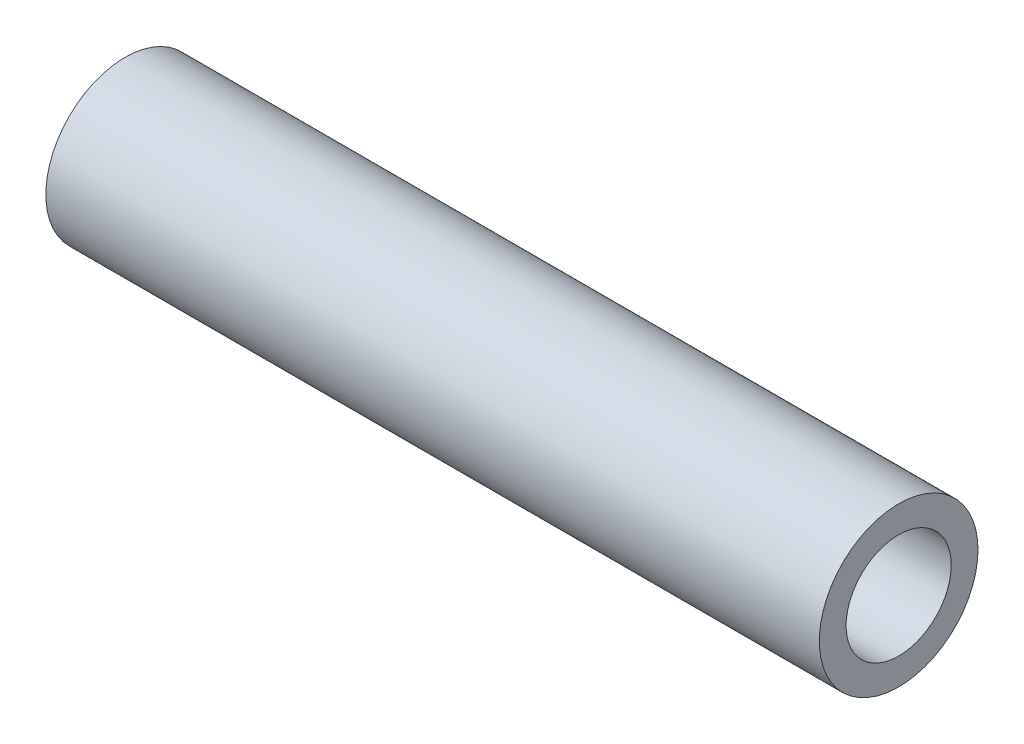
ISO-10303-21;
HEADER;
FILE_DESCRIPTION(('STEP AP214'),'2;1');
FILE_NAME('part.step','',(''),(''),'','','');
FILE_SCHEMA(('AUTOMOTIVE_DESIGN { 1 0 10303 214 1 1 1 1 }'));
ENDSEC;
DATA;
#1=APPLICATION_CONTEXT('core data for automotive mechanical design processes');
#2=APPLICATION_PROTOCOL_DEFINITION('international standard','automotive_design',2000,#1);
#3=PRODUCT_CONTEXT('',#1,'mechanical');
#4=PRODUCT('Part','Part','',(#3));
#5=PRODUCT_RELATED_PRODUCT_CATEGORY('part','',(#4));
#6=PRODUCT_DEFINITION_FORMATION('','',#4);
#7=PRODUCT_DEFINITION_CONTEXT('part definition',#1,'design');
#8=PRODUCT_DEFINITION('design','',#6,#7);
#9=PRODUCT_DEFINITION_SHAPE('','',#8);
#10=(LENGTH_UNIT() NAMED_UNIT(*) SI_UNIT(.MILLI.,.METRE.));
#11=(NAMED_UNIT(*) PLANE_ANGLE_UNIT() SI_UNIT($,.RADIAN.));
#12=(NAMED_UNIT(*) SI_UNIT($,.STERADIAN.) SOLID_ANGLE_UNIT());
#13=UNCERTAINTY_MEASURE_WITH_UNIT(LENGTH_MEASURE(1.E-05),#10,'distance_accuracy_value','');
#14=(GEOMETRIC_REPRESENTATION_CONTEXT(3) GLOBAL_UNCERTAINTY_ASSIGNED_CONTEXT((#13)) GLOBAL_UNIT_ASSIGNED_CONTEXT((#10,
#11,#12)) REPRESENTATION_CONTEXT('',''));
#15=CARTESIAN_POINT('',(0.,0.,0.));
#16=DIRECTION('',(0.,0.,1.));
#17=DIRECTION('',(1.,0.,0.));
#18=AXIS2_PLACEMENT_3D('',#15,#16,#17);
#19=CARTESIAN_POINT('',(39.,0.,0.));
#20=DIRECTION('',(1.,0.,0.));
#21=DIRECTION('',(0.,0.,-1.));
#22=AXIS2_PLACEMENT_3D('',#19,#20,#21);
#23=PLANE('',#22);
#24=CARTESIAN_POINT('',(39.,0.,0.));
#25=DIRECTION('',(1.,0.,0.));
#26=DIRECTION('',(0.,0.,-1.));
#27=AXIS2_PLACEMENT_3D('',#24,#25,#26);
#28=CIRCLE('',#27,4.);
#29=CARTESIAN_POINT('',(39.,0.,-4.));
#30=VERTEX_POINT('',#29);
#31=EDGE_CURVE('E10',#30,#30,#28,.T.);
#32=ORIENTED_EDGE('',*,*,#31,.T.);
#33=EDGE_LOOP('',(#32));
#34=FACE_BOUND('',#33,.T.);
#35=CARTESIAN_POINT('',(39.,0.,0.));
#36=DIRECTION('',(1.,0.,0.));
#37=DIRECTION('',(0.,0.,-1.));
#38=AXIS2_PLACEMENT_3D('',#35,#36,#37);
#39=CIRCLE('',#38,2.65);
#40=CARTESIAN_POINT('',(39.,0.,-2.65));
#41=VERTEX_POINT('',#40);
#42=EDGE_CURVE('E52',#41,#41,#39,.T.);
#43=ORIENTED_EDGE('',*,*,#42,.F.);
#44=EDGE_LOOP('',(#43));
#45=FACE_BOUND('',#44,.T.);
#46=ADVANCED_FACE('F41',(#34,#45),#23,.T.);
#47=CARTESIAN_POINT('',(0.,0.,0.));
#48=DIRECTION('',(1.,0.,0.));
#49=DIRECTION('',(0.,0.,-1.));
#50=AXIS2_PLACEMENT_3D('',#47,#48,#49);
#51=PLANE('',#50);
#52=CARTESIAN_POINT('',(0.,0.,0.));
#53=DIRECTION('',(1.,0.,0.));
#54=DIRECTION('',(0.,0.,-1.));
#55=AXIS2_PLACEMENT_3D('',#52,#53,#54);
#56=CIRCLE('',#55,4.);
#57=CARTESIAN_POINT('',(0.,0.,-4.));
#58=VERTEX_POINT('',#57);
#59=EDGE_CURVE('E45',#58,#58,#56,.T.);
#60=ORIENTED_EDGE('',*,*,#59,.F.);
#61=EDGE_LOOP('',(#60));
#62=FACE_BOUND('',#61,.T.);
#63=CARTESIAN_POINT('',(0.,0.,0.));
#64=DIRECTION('',(1.,0.,0.));
#65=DIRECTION('',(0.,0.,-1.));
#66=AXIS2_PLACEMENT_3D('',#63,#64,#65);
#67=CIRCLE('',#66,2.65);
#68=CARTESIAN_POINT('',(0.,0.,-2.65));
#69=VERTEX_POINT('',#68);
#70=EDGE_CURVE('E54',#69,#69,#67,.T.);
#71=ORIENTED_EDGE('',*,*,#70,.T.);
#72=EDGE_LOOP('',(#71));
#73=FACE_BOUND('',#72,.T.);
#74=ADVANCED_FACE('F64',(#62,#73),#51,.F.);
#75=CARTESIAN_POINT('',(39.,0.,0.));
#76=DIRECTION('',(-1.,0.,0.));
#77=DIRECTION('',(0.,0.,1.));
#78=AXIS2_PLACEMENT_3D('',#75,#76,#77);
#79=CYLINDRICAL_SURFACE('',#78,4.);
#80=ORIENTED_EDGE('',*,*,#31,.F.);
#81=EDGE_LOOP('',(#80));
#82=FACE_BOUND('',#81,.T.);
#83=ORIENTED_EDGE('',*,*,#59,.T.);
#84=EDGE_LOOP('',(#83));
#85=FACE_BOUND('',#84,.T.);
#86=ADVANCED_FACE('F43',(#82,#85),#79,.T.);
#87=CARTESIAN_POINT('',(39.,0.,0.));
#88=DIRECTION('',(-1.,0.,0.));
#89=DIRECTION('',(0.,0.,1.));
#90=AXIS2_PLACEMENT_3D('',#87,#88,#89);
#91=CYLINDRICAL_SURFACE('',#90,2.65);
#92=ORIENTED_EDGE('',*,*,#42,.T.);
#93=EDGE_LOOP('',(#92));
#94=FACE_BOUND('',#93,.T.);
#95=ORIENTED_EDGE('',*,*,#70,.F.);
#96=EDGE_LOOP('',(#95));
#97=FACE_BOUND('',#96,.T.);
#98=ADVANCED_FACE('F60',(#94,#97),#91,.F.);
#99=CLOSED_SHELL('',(#46,#74,#86,#98));
#100=MANIFOLD_SOLID_BREP('B2',#99);
#101=ADVANCED_BREP_SHAPE_REPRESENTATION('',(#18,#100),#14);
#102=SHAPE_DEFINITION_REPRESENTATION(#9,#101);
ENDSEC;
END-ISO-10303-21;
